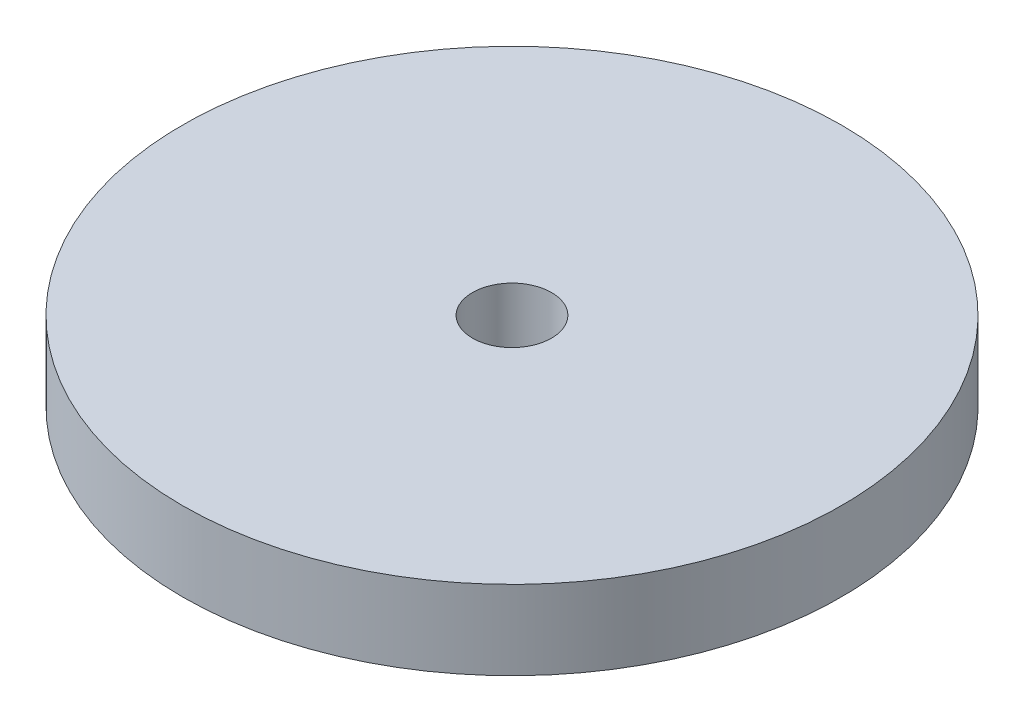
ISO-10303-21;
HEADER;
FILE_DESCRIPTION(('STEP AP214'),'2;1');
FILE_NAME('part.step','',(''),(''),'','','');
FILE_SCHEMA(('AUTOMOTIVE_DESIGN { 1 0 10303 214 1 1 1 1 }'));
ENDSEC;
DATA;
#1=APPLICATION_CONTEXT('core data for automotive mechanical design processes');
#2=APPLICATION_PROTOCOL_DEFINITION('international standard','automotive_design',2000,#1);
#3=PRODUCT_CONTEXT('',#1,'mechanical');
#4=PRODUCT('Part','Part','',(#3));
#5=PRODUCT_RELATED_PRODUCT_CATEGORY('part','',(#4));
#6=PRODUCT_DEFINITION_FORMATION('','',#4);
#7=PRODUCT_DEFINITION_CONTEXT('part definition',#1,'design');
#8=PRODUCT_DEFINITION('design','',#6,#7);
#9=PRODUCT_DEFINITION_SHAPE('','',#8);
#10=(LENGTH_UNIT() NAMED_UNIT(*) SI_UNIT(.MILLI.,.METRE.));
#11=(NAMED_UNIT(*) PLANE_ANGLE_UNIT() SI_UNIT($,.RADIAN.));
#12=(NAMED_UNIT(*) SI_UNIT($,.STERADIAN.) SOLID_ANGLE_UNIT());
#13=UNCERTAINTY_MEASURE_WITH_UNIT(LENGTH_MEASURE(1.E-05),#10,'distance_accuracy_value','');
#14=(GEOMETRIC_REPRESENTATION_CONTEXT(3) GLOBAL_UNCERTAINTY_ASSIGNED_CONTEXT((#13)) GLOBAL_UNIT_ASSIGNED_CONTEXT((#10,
#11,#12)) REPRESENTATION_CONTEXT('',''));
#15=CARTESIAN_POINT('',(0.,0.,0.));
#16=DIRECTION('',(0.,0.,1.));
#17=DIRECTION('',(1.,0.,0.));
#18=AXIS2_PLACEMENT_3D('',#15,#16,#17);
#19=CARTESIAN_POINT('',(0.,3.,0.));
#20=DIRECTION('',(0.,1.,0.));
#21=DIRECTION('',(0.,0.,1.));
#22=AXIS2_PLACEMENT_3D('',#19,#20,#21);
#23=PLANE('',#22);
#24=CARTESIAN_POINT('',(0.,3.,0.));
#25=DIRECTION('',(0.,1.,0.));
#26=DIRECTION('',(0.,0.,1.));
#27=AXIS2_PLACEMENT_3D('',#24,#25,#26);
#28=CIRCLE('',#27,12.5);
#29=CARTESIAN_POINT('',(0.,3.,12.5));
#30=VERTEX_POINT('',#29);
#31=EDGE_CURVE('E10',#30,#30,#28,.T.);
#32=ORIENTED_EDGE('',*,*,#31,.T.);
#33=EDGE_LOOP('',(#32));
#34=FACE_BOUND('',#33,.T.);
#35=CARTESIAN_POINT('',(0.,3.,0.));
#36=DIRECTION('',(0.,1.,0.));
#37=DIRECTION('',(0.,0.,1.));
#38=AXIS2_PLACEMENT_3D('',#35,#36,#37);
#39=CIRCLE('',#38,1.5);
#40=CARTESIAN_POINT('',(0.,3.,1.5));
#41=VERTEX_POINT('',#40);
#42=EDGE_CURVE('E43',#41,#41,#39,.T.);
#43=ORIENTED_EDGE('',*,*,#42,.F.);
#44=EDGE_LOOP('',(#43));
#45=FACE_BOUND('',#44,.T.);
#46=ADVANCED_FACE('F32',(#34,#45),#23,.T.);
#47=CARTESIAN_POINT('',(0.,0.,0.));
#48=DIRECTION('',(0.,1.,0.));
#49=DIRECTION('',(0.,0.,1.));
#50=AXIS2_PLACEMENT_3D('',#47,#48,#49);
#51=PLANE('',#50);
#52=CARTESIAN_POINT('',(0.,0.,0.));
#53=DIRECTION('',(0.,1.,0.));
#54=DIRECTION('',(0.,0.,1.));
#55=AXIS2_PLACEMENT_3D('',#52,#53,#54);
#56=CIRCLE('',#55,12.5);
#57=CARTESIAN_POINT('',(0.,0.,12.5));
#58=VERTEX_POINT('',#57);
#59=EDGE_CURVE('E36',#58,#58,#56,.T.);
#60=ORIENTED_EDGE('',*,*,#59,.F.);
#61=EDGE_LOOP('',(#60));
#62=FACE_BOUND('',#61,.T.);
#63=CARTESIAN_POINT('',(0.,0.,0.));
#64=DIRECTION('',(0.,1.,0.));
#65=DIRECTION('',(0.,0.,1.));
#66=AXIS2_PLACEMENT_3D('',#63,#64,#65);
#67=CIRCLE('',#66,1.5);
#68=CARTESIAN_POINT('',(0.,0.,1.5));
#69=VERTEX_POINT('',#68);
#70=EDGE_CURVE('E45',#69,#69,#67,.T.);
#71=ORIENTED_EDGE('',*,*,#70,.T.);
#72=EDGE_LOOP('',(#71));
#73=FACE_BOUND('',#72,.T.);
#74=ADVANCED_FACE('F55',(#62,#73),#51,.F.);
#75=CARTESIAN_POINT('',(0.,3.,0.));
#76=DIRECTION('',(0.,-1.,0.));
#77=DIRECTION('',(0.,0.,-1.));
#78=AXIS2_PLACEMENT_3D('',#75,#76,#77);
#79=CYLINDRICAL_SURFACE('',#78,12.5);
#80=ORIENTED_EDGE('',*,*,#31,.F.);
#81=EDGE_LOOP('',(#80));
#82=FACE_BOUND('',#81,.T.);
#83=ORIENTED_EDGE('',*,*,#59,.T.);
#84=EDGE_LOOP('',(#83));
#85=FACE_BOUND('',#84,.T.);
#86=ADVANCED_FACE('F34',(#82,#85),#79,.T.);
#87=CARTESIAN_POINT('',(0.,3.,0.));
#88=DIRECTION('',(0.,-1.,0.));
#89=DIRECTION('',(0.,0.,-1.));
#90=AXIS2_PLACEMENT_3D('',#87,#88,#89);
#91=CYLINDRICAL_SURFACE('',#90,1.5);
#92=ORIENTED_EDGE('',*,*,#42,.T.);
#93=EDGE_LOOP('',(#92));
#94=FACE_BOUND('',#93,.T.);
#95=ORIENTED_EDGE('',*,*,#70,.F.);
#96=EDGE_LOOP('',(#95));
#97=FACE_BOUND('',#96,.T.);
#98=ADVANCED_FACE('F51',(#94,#97),#91,.F.);
#99=CLOSED_SHELL('',(#46,#74,#86,#98));
#100=MANIFOLD_SOLID_BREP('B2',#99);
#101=ADVANCED_BREP_SHAPE_REPRESENTATION('',(#18,#100),#14);
#102=SHAPE_DEFINITION_REPRESENTATION(#9,#101);
ENDSEC;
END-ISO-10303-21;
